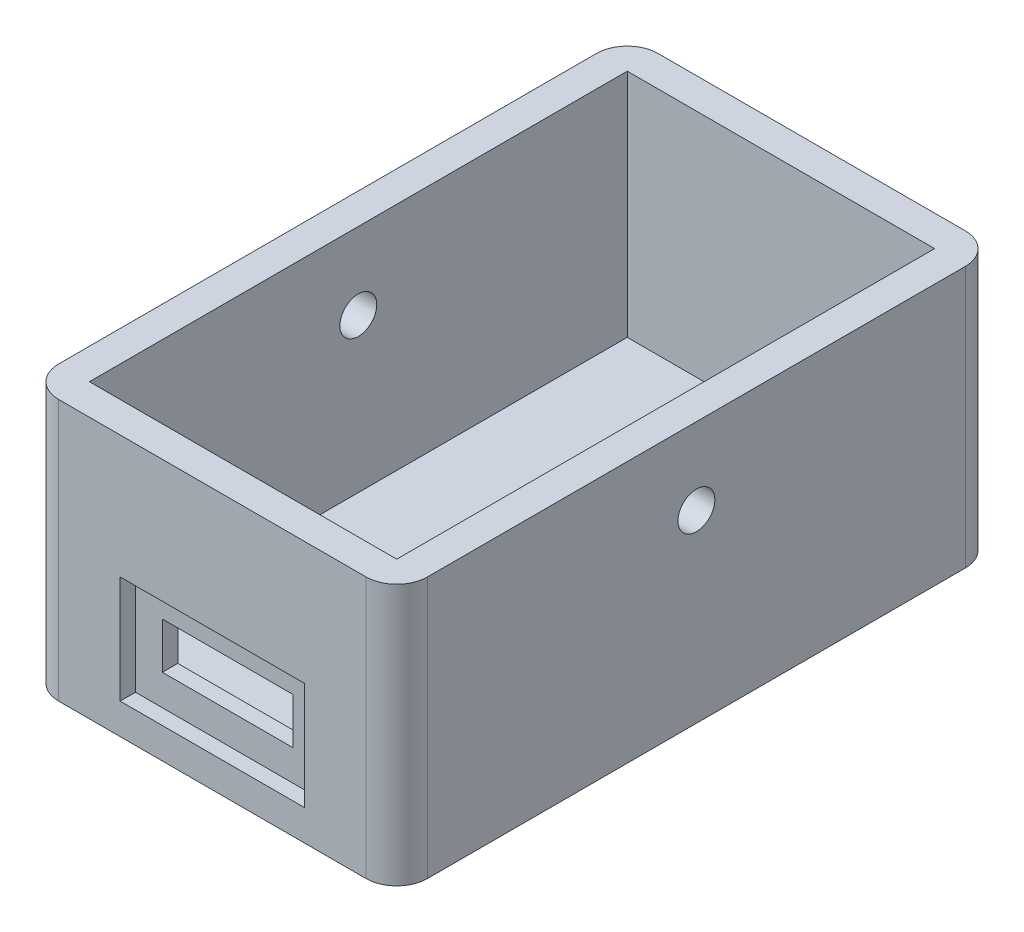
ISO-10303-21;
HEADER;
FILE_DESCRIPTION(('STEP AP214'),'2;1');
FILE_NAME('part.step','',(''),(''),'','','');
FILE_SCHEMA(('AUTOMOTIVE_DESIGN { 1 0 10303 214 1 1 1 1 }'));
ENDSEC;
DATA;
#1=APPLICATION_CONTEXT('core data for automotive mechanical design processes');
#2=APPLICATION_PROTOCOL_DEFINITION('international standard','automotive_design',2000,#1);
#3=PRODUCT_CONTEXT('',#1,'mechanical');
#4=PRODUCT('Part','Part','',(#3));
#5=PRODUCT_RELATED_PRODUCT_CATEGORY('part','',(#4));
#6=PRODUCT_DEFINITION_FORMATION('','',#4);
#7=PRODUCT_DEFINITION_CONTEXT('part definition',#1,'design');
#8=PRODUCT_DEFINITION('design','',#6,#7);
#9=PRODUCT_DEFINITION_SHAPE('','',#8);
#10=(LENGTH_UNIT() NAMED_UNIT(*) SI_UNIT(.MILLI.,.METRE.));
#11=(NAMED_UNIT(*) PLANE_ANGLE_UNIT() SI_UNIT($,.RADIAN.));
#12=(NAMED_UNIT(*) SI_UNIT($,.STERADIAN.) SOLID_ANGLE_UNIT());
#13=UNCERTAINTY_MEASURE_WITH_UNIT(LENGTH_MEASURE(1.E-05),#10,'distance_accuracy_value','');
#14=(GEOMETRIC_REPRESENTATION_CONTEXT(3) GLOBAL_UNCERTAINTY_ASSIGNED_CONTEXT((#13)) GLOBAL_UNIT_ASSIGNED_CONTEXT((#10,
#11,#12)) REPRESENTATION_CONTEXT('',''));
#15=CARTESIAN_POINT('',(0.,0.,0.));
#16=DIRECTION('',(0.,0.,1.));
#17=DIRECTION('',(1.,0.,0.));
#18=AXIS2_PLACEMENT_3D('',#15,#16,#17);
#19=CARTESIAN_POINT('',(-6.72058823529412,7.,7.88235294117647));
#20=DIRECTION('',(-1.,0.,0.));
#21=DIRECTION('',(0.,-1.,0.));
#22=AXIS2_PLACEMENT_3D('',#19,#20,#21);
#23=PLANE('',#22);
#24=DIRECTION('',(0.,1.,0.));
#25=VECTOR('',#24,1.);
#26=CARTESIAN_POINT('',(-6.72058823529412,7.,23.8823529411765));
#27=LINE('',#26,#25);
#28=CARTESIAN_POINT('',(-6.72058823529412,4.,23.8823529411765));
#29=VERTEX_POINT('',#28);
#30=CARTESIAN_POINT('',(-6.72058823529412,7.,23.8823529411765));
#31=VERTEX_POINT('',#30);
#32=EDGE_CURVE('E214',#29,#31,#27,.T.);
#33=ORIENTED_EDGE('',*,*,#32,.F.);
#34=DIRECTION('',(0.,0.,1.));
#35=VECTOR('',#34,1.);
#36=CARTESIAN_POINT('',(-6.72058823529412,4.,7.88235294117647));
#37=LINE('',#36,#35);
#38=CARTESIAN_POINT('',(-6.72058823529412,4.,22.8823529411765));
#39=VERTEX_POINT('',#38);
#40=EDGE_CURVE('E216',#39,#29,#37,.T.);
#41=ORIENTED_EDGE('',*,*,#40,.F.);
#42=DIRECTION('',(0.,1.,0.));
#43=VECTOR('',#42,1.);
#44=CARTESIAN_POINT('',(-6.72058823529412,17.,22.8823529411765));
#45=LINE('',#44,#43);
#46=CARTESIAN_POINT('',(-6.72058823529412,7.,22.8823529411765));
#47=VERTEX_POINT('',#46);
#48=EDGE_CURVE('E42',#39,#47,#45,.T.);
#49=ORIENTED_EDGE('',*,*,#48,.T.);
#50=DIRECTION('',(0.,0.,1.));
#51=VECTOR('',#50,1.);
#52=CARTESIAN_POINT('',(-6.72058823529412,7.,7.88235294117647));
#53=LINE('',#52,#51);
#54=EDGE_CURVE('E217',#47,#31,#53,.T.);
#55=ORIENTED_EDGE('',*,*,#54,.T.);
#56=EDGE_LOOP('',(#33,#41,#49,#55));
#57=FACE_BOUND('',#56,.T.);
#58=ADVANCED_FACE('F33',(#57),#23,.F.);
#59=CARTESIAN_POINT('',(-6.72058823529412,7.,7.88235294117647));
#60=DIRECTION('',(0.,1.,0.));
#61=DIRECTION('',(-1.,0.,0.));
#62=AXIS2_PLACEMENT_3D('',#59,#60,#61);
#63=PLANE('',#62);
#64=DIRECTION('',(1.,0.,0.));
#65=VECTOR('',#64,1.);
#66=CARTESIAN_POINT('',(-6.72058823529412,7.,23.8823529411765));
#67=LINE('',#66,#65);
#68=CARTESIAN_POINT('',(1.77941176470588,7.,23.8823529411765));
#69=VERTEX_POINT('',#68);
#70=EDGE_CURVE('E212',#31,#69,#67,.T.);
#71=ORIENTED_EDGE('',*,*,#70,.F.);
#72=ORIENTED_EDGE('',*,*,#54,.F.);
#73=DIRECTION('',(1.,0.,0.));
#74=VECTOR('',#73,1.);
#75=CARTESIAN_POINT('',(-14.4705882352941,7.,22.8823529411765));
#76=LINE('',#75,#74);
#77=CARTESIAN_POINT('',(1.77941176470588,7.,22.8823529411765));
#78=VERTEX_POINT('',#77);
#79=EDGE_CURVE('E321',#47,#78,#76,.T.);
#80=ORIENTED_EDGE('',*,*,#79,.T.);
#81=DIRECTION('',(0.,0.,1.));
#82=VECTOR('',#81,1.);
#83=CARTESIAN_POINT('',(1.77941176470588,7.,7.88235294117647));
#84=LINE('',#83,#82);
#85=EDGE_CURVE('E221',#78,#69,#84,.T.);
#86=ORIENTED_EDGE('',*,*,#85,.T.);
#87=EDGE_LOOP('',(#71,#72,#80,#86));
#88=FACE_BOUND('',#87,.T.);
#89=ADVANCED_FACE('F333',(#88),#63,.F.);
#90=CARTESIAN_POINT('',(1.77941176470588,7.,7.88235294117647));
#91=DIRECTION('',(1.,0.,0.));
#92=DIRECTION('',(0.,1.,0.));
#93=AXIS2_PLACEMENT_3D('',#90,#91,#92);
#94=PLANE('',#93);
#95=DIRECTION('',(0.,-1.,0.));
#96=VECTOR('',#95,1.);
#97=CARTESIAN_POINT('',(1.77941176470588,7.,23.8823529411765));
#98=LINE('',#97,#96);
#99=CARTESIAN_POINT('',(1.77941176470588,4.,23.8823529411765));
#100=VERTEX_POINT('',#99);
#101=EDGE_CURVE('E56',#69,#100,#98,.T.);
#102=ORIENTED_EDGE('',*,*,#101,.F.);
#103=ORIENTED_EDGE('',*,*,#85,.F.);
#104=DIRECTION('',(0.,-1.,0.));
#105=VECTOR('',#104,1.);
#106=CARTESIAN_POINT('',(1.77941176470588,17.,22.8823529411765));
#107=LINE('',#106,#105);
#108=CARTESIAN_POINT('',(1.77941176470588,4.,22.8823529411765));
#109=VERTEX_POINT('',#108);
#110=EDGE_CURVE('E318',#78,#109,#107,.T.);
#111=ORIENTED_EDGE('',*,*,#110,.T.);
#112=DIRECTION('',(0.,0.,1.));
#113=VECTOR('',#112,1.);
#114=CARTESIAN_POINT('',(1.77941176470588,4.,7.88235294117647));
#115=LINE('',#114,#113);
#116=EDGE_CURVE('E224',#109,#100,#115,.T.);
#117=ORIENTED_EDGE('',*,*,#116,.T.);
#118=EDGE_LOOP('',(#102,#103,#111,#117));
#119=FACE_BOUND('',#118,.T.);
#120=ADVANCED_FACE('F339',(#119),#94,.F.);
#121=CARTESIAN_POINT('',(-6.72058823529412,4.,7.88235294117647));
#122=DIRECTION('',(0.,-1.,0.));
#123=DIRECTION('',(0.,0.,-1.));
#124=AXIS2_PLACEMENT_3D('',#121,#122,#123);
#125=PLANE('',#124);
#126=DIRECTION('',(-1.,0.,0.));
#127=VECTOR('',#126,1.);
#128=CARTESIAN_POINT('',(-6.72058823529412,4.,23.8823529411765));
#129=LINE('',#128,#127);
#130=EDGE_CURVE('E11',#100,#29,#129,.T.);
#131=ORIENTED_EDGE('',*,*,#130,.F.);
#132=ORIENTED_EDGE('',*,*,#116,.F.);
#133=DIRECTION('',(-1.,0.,0.));
#134=VECTOR('',#133,1.);
#135=CARTESIAN_POINT('',(-14.4705882352941,4.,22.8823529411765));
#136=LINE('',#135,#134);
#137=EDGE_CURVE('E316',#109,#39,#136,.T.);
#138=ORIENTED_EDGE('',*,*,#137,.T.);
#139=ORIENTED_EDGE('',*,*,#40,.T.);
#140=EDGE_LOOP('',(#131,#132,#138,#139));
#141=FACE_BOUND('',#140,.T.);
#142=ADVANCED_FACE('F341',(#141),#125,.F.);
#143=CARTESIAN_POINT('',(-14.4705882352941,17.,-14.1176470588235));
#144=DIRECTION('',(1.,0.,0.));
#145=DIRECTION('',(0.,0.,-1.));
#146=AXIS2_PLACEMENT_3D('',#143,#144,#145);
#147=PLANE('',#146);
#148=CARTESIAN_POINT('',(-14.4705882352941,12.,5.38235294117647));
#149=DIRECTION('',(1.,0.,0.));
#150=DIRECTION('',(0.,0.,-1.));
#151=AXIS2_PLACEMENT_3D('',#148,#149,#150);
#152=CIRCLE('',#151,1.2);
#153=CARTESIAN_POINT('',(-14.4705882352941,12.,4.18235294117647));
#154=VERTEX_POINT('',#153);
#155=EDGE_CURVE('E196',#154,#154,#152,.T.);
#156=ORIENTED_EDGE('',*,*,#155,.T.);
#157=EDGE_LOOP('',(#156));
#158=FACE_BOUND('',#157,.T.);
#159=DIRECTION('',(0.,0.,1.));
#160=VECTOR('',#159,1.);
#161=CARTESIAN_POINT('',(-14.4705882352941,17.,-14.1176470588235));
#162=LINE('',#161,#160);
#163=CARTESIAN_POINT('',(-14.4705882352941,17.,-12.1176470588235));
#164=VERTEX_POINT('',#163);
#165=CARTESIAN_POINT('',(-14.4705882352941,17.,22.8823529411765));
#166=VERTEX_POINT('',#165);
#167=EDGE_CURVE('E257',#164,#166,#162,.T.);
#168=ORIENTED_EDGE('',*,*,#167,.F.);
#169=DIRECTION('',(0.,-1.,0.));
#170=VECTOR('',#169,1.);
#171=CARTESIAN_POINT('',(-14.4705882352941,17.,-12.1176470588235));
#172=LINE('',#171,#170);
#173=CARTESIAN_POINT('',(-14.4705882352941,0.,-12.1176470588235));
#174=VERTEX_POINT('',#173);
#175=EDGE_CURVE('E282',#164,#174,#172,.T.);
#176=ORIENTED_EDGE('',*,*,#175,.T.);
#177=DIRECTION('',(0.,0.,1.));
#178=VECTOR('',#177,1.);
#179=CARTESIAN_POINT('',(-14.4705882352941,0.,-14.1176470588235));
#180=LINE('',#179,#178);
#181=CARTESIAN_POINT('',(-14.4705882352941,0.,22.8823529411765));
#182=VERTEX_POINT('',#181);
#183=EDGE_CURVE('E245',#174,#182,#180,.T.);
#184=ORIENTED_EDGE('',*,*,#183,.T.);
#185=DIRECTION('',(0.,-1.,0.));
#186=VECTOR('',#185,1.);
#187=CARTESIAN_POINT('',(-14.4705882352941,17.,22.8823529411765));
#188=LINE('',#187,#186);
#189=EDGE_CURVE('E270',#182,#166,#188,.F.);
#190=ORIENTED_EDGE('',*,*,#189,.T.);
#191=EDGE_LOOP('',(#168,#176,#184,#190));
#192=FACE_BOUND('',#191,.T.);
#193=ADVANCED_FACE('F398',(#158,#192),#147,.F.);
#194=CARTESIAN_POINT('',(-14.4705882352941,17.,24.8823529411765));
#195=DIRECTION('',(0.,0.,-1.));
#196=DIRECTION('',(-1.,0.,0.));
#197=AXIS2_PLACEMENT_3D('',#194,#195,#196);
#198=PLANE('',#197);
#199=DIRECTION('',(1.,0.,0.));
#200=VECTOR('',#199,1.);
#201=CARTESIAN_POINT('',(-8.47058823529412,2.,24.8823529411765));
#202=LINE('',#201,#200);
#203=CARTESIAN_POINT('',(-8.47058823529412,2.,24.8823529411765));
#204=VERTEX_POINT('',#203);
#205=CARTESIAN_POINT('',(3.52941176470588,2.,24.8823529411765));
#206=VERTEX_POINT('',#205);
#207=EDGE_CURVE('E202',#204,#206,#202,.T.);
#208=ORIENTED_EDGE('',*,*,#207,.F.);
#209=DIRECTION('',(0.,-1.,0.));
#210=VECTOR('',#209,1.);
#211=CARTESIAN_POINT('',(-8.47058823529412,9.,24.8823529411765));
#212=LINE('',#211,#210);
#213=CARTESIAN_POINT('',(-8.47058823529412,9.,24.8823529411765));
#214=VERTEX_POINT('',#213);
#215=EDGE_CURVE('E49',#214,#204,#212,.T.);
#216=ORIENTED_EDGE('',*,*,#215,.F.);
#217=DIRECTION('',(-1.,0.,0.));
#218=VECTOR('',#217,1.);
#219=CARTESIAN_POINT('',(-8.47058823529412,9.,24.8823529411765));
#220=LINE('',#219,#218);
#221=CARTESIAN_POINT('',(3.52941176470588,9.,24.8823529411765));
#222=VERTEX_POINT('',#221);
#223=EDGE_CURVE('E190',#222,#214,#220,.T.);
#224=ORIENTED_EDGE('',*,*,#223,.F.);
#225=DIRECTION('',(0.,1.,0.));
#226=VECTOR('',#225,1.);
#227=CARTESIAN_POINT('',(3.52941176470588,9.,24.8823529411765));
#228=LINE('',#227,#226);
#229=EDGE_CURVE('E193',#206,#222,#228,.T.);
#230=ORIENTED_EDGE('',*,*,#229,.F.);
#231=EDGE_LOOP('',(#208,#216,#224,#230));
#232=FACE_BOUND('',#231,.T.);
#233=DIRECTION('',(1.,0.,0.));
#234=VECTOR('',#233,1.);
#235=CARTESIAN_POINT('',(-14.4705882352941,17.,24.8823529411765));
#236=LINE('',#235,#234);
#237=CARTESIAN_POINT('',(-12.4705882352941,17.,24.8823529411765));
#238=VERTEX_POINT('',#237);
#239=CARTESIAN_POINT('',(7.52941176470588,17.,24.8823529411765));
#240=VERTEX_POINT('',#239);
#241=EDGE_CURVE('E260',#238,#240,#236,.T.);
#242=ORIENTED_EDGE('',*,*,#241,.F.);
#243=DIRECTION('',(0.,-1.,0.));
#244=VECTOR('',#243,1.);
#245=CARTESIAN_POINT('',(-12.4705882352941,17.,24.8823529411765));
#246=LINE('',#245,#244);
#247=CARTESIAN_POINT('',(-12.4705882352941,0.,24.8823529411765));
#248=VERTEX_POINT('',#247);
#249=EDGE_CURVE('E308',#238,#248,#246,.T.);
#250=ORIENTED_EDGE('',*,*,#249,.T.);
#251=DIRECTION('',(1.,0.,0.));
#252=VECTOR('',#251,1.);
#253=CARTESIAN_POINT('',(-14.4705882352941,0.,24.8823529411765));
#254=LINE('',#253,#252);
#255=CARTESIAN_POINT('',(7.52941176470588,0.,24.8823529411765));
#256=VERTEX_POINT('',#255);
#257=EDGE_CURVE('E273',#248,#256,#254,.T.);
#258=ORIENTED_EDGE('',*,*,#257,.T.);
#259=DIRECTION('',(0.,-1.,0.));
#260=VECTOR('',#259,1.);
#261=CARTESIAN_POINT('',(7.52941176470588,17.,24.8823529411765));
#262=LINE('',#261,#260);
#263=EDGE_CURVE('E306',#256,#240,#262,.F.);
#264=ORIENTED_EDGE('',*,*,#263,.T.);
#265=EDGE_LOOP('',(#242,#250,#258,#264));
#266=FACE_BOUND('',#265,.T.);
#267=ADVANCED_FACE('F394',(#232,#266),#198,.F.);
#268=CARTESIAN_POINT('',(9.52941176470588,17.,-14.1176470588235));
#269=DIRECTION('',(-1.,0.,0.));
#270=DIRECTION('',(0.,0.,1.));
#271=AXIS2_PLACEMENT_3D('',#268,#269,#270);
#272=PLANE('',#271);
#273=CARTESIAN_POINT('',(9.52941176470588,12.,5.38235294117647));
#274=DIRECTION('',(1.,0.,0.));
#275=DIRECTION('',(0.,0.,-1.));
#276=AXIS2_PLACEMENT_3D('',#273,#274,#275);
#277=CIRCLE('',#276,1.2);
#278=CARTESIAN_POINT('',(9.52941176470588,12.,4.18235294117647));
#279=VERTEX_POINT('',#278);
#280=EDGE_CURVE('E554',#279,#279,#277,.T.);
#281=ORIENTED_EDGE('',*,*,#280,.F.);
#282=EDGE_LOOP('',(#281));
#283=FACE_BOUND('',#282,.T.);
#284=DIRECTION('',(0.,0.,-1.));
#285=VECTOR('',#284,1.);
#286=CARTESIAN_POINT('',(9.52941176470588,17.,-14.1176470588235));
#287=LINE('',#286,#285);
#288=CARTESIAN_POINT('',(9.52941176470588,17.,22.8823529411765));
#289=VERTEX_POINT('',#288);
#290=CARTESIAN_POINT('',(9.52941176470588,17.,-12.1176470588235));
#291=VERTEX_POINT('',#290);
#292=EDGE_CURVE('E264',#289,#291,#287,.T.);
#293=ORIENTED_EDGE('',*,*,#292,.F.);
#294=DIRECTION('',(0.,-1.,0.));
#295=VECTOR('',#294,1.);
#296=CARTESIAN_POINT('',(9.52941176470588,17.,22.8823529411765));
#297=LINE('',#296,#295);
#298=CARTESIAN_POINT('',(9.52941176470588,0.,22.8823529411765));
#299=VERTEX_POINT('',#298);
#300=EDGE_CURVE('E313',#289,#299,#297,.T.);
#301=ORIENTED_EDGE('',*,*,#300,.T.);
#302=DIRECTION('',(0.,0.,-1.));
#303=VECTOR('',#302,1.);
#304=CARTESIAN_POINT('',(9.52941176470588,0.,-14.1176470588235));
#305=LINE('',#304,#303);
#306=CARTESIAN_POINT('',(9.52941176470588,0.,-12.1176470588235));
#307=VERTEX_POINT('',#306);
#308=EDGE_CURVE('E276',#299,#307,#305,.T.);
#309=ORIENTED_EDGE('',*,*,#308,.T.);
#310=DIRECTION('',(0.,-1.,0.));
#311=VECTOR('',#310,1.);
#312=CARTESIAN_POINT('',(9.52941176470588,17.,-12.1176470588235));
#313=LINE('',#312,#311);
#314=EDGE_CURVE('E311',#307,#291,#313,.F.);
#315=ORIENTED_EDGE('',*,*,#314,.T.);
#316=EDGE_LOOP('',(#293,#301,#309,#315));
#317=FACE_BOUND('',#316,.T.);
#318=ADVANCED_FACE('F390',(#283,#317),#272,.F.);
#319=CARTESIAN_POINT('',(-14.4705882352941,17.,-14.1176470588235));
#320=DIRECTION('',(0.,0.,1.));
#321=DIRECTION('',(1.,0.,0.));
#322=AXIS2_PLACEMENT_3D('',#319,#320,#321);
#323=PLANE('',#322);
#324=DIRECTION('',(-1.,0.,0.));
#325=VECTOR('',#324,1.);
#326=CARTESIAN_POINT('',(-14.4705882352941,0.,-14.1176470588235));
#327=LINE('',#326,#325);
#328=CARTESIAN_POINT('',(7.52941176470588,0.,-14.1176470588235));
#329=VERTEX_POINT('',#328);
#330=CARTESIAN_POINT('',(-12.4705882352941,0.,-14.1176470588235));
#331=VERTEX_POINT('',#330);
#332=EDGE_CURVE('E261',#329,#331,#327,.T.);
#333=ORIENTED_EDGE('',*,*,#332,.T.);
#334=DIRECTION('',(0.,-1.,0.));
#335=VECTOR('',#334,1.);
#336=CARTESIAN_POINT('',(-12.4705882352941,17.,-14.1176470588235));
#337=LINE('',#336,#335);
#338=CARTESIAN_POINT('',(-12.4705882352941,17.,-14.1176470588235));
#339=VERTEX_POINT('',#338);
#340=EDGE_CURVE('E296',#331,#339,#337,.F.);
#341=ORIENTED_EDGE('',*,*,#340,.T.);
#342=DIRECTION('',(-1.,0.,0.));
#343=VECTOR('',#342,1.);
#344=CARTESIAN_POINT('',(-14.4705882352941,17.,-14.1176470588235));
#345=LINE('',#344,#343);
#346=CARTESIAN_POINT('',(7.52941176470588,17.,-14.1176470588235));
#347=VERTEX_POINT('',#346);
#348=EDGE_CURVE('E267',#347,#339,#345,.T.);
#349=ORIENTED_EDGE('',*,*,#348,.F.);
#350=DIRECTION('',(0.,-1.,0.));
#351=VECTOR('',#350,1.);
#352=CARTESIAN_POINT('',(7.52941176470588,17.,-14.1176470588235));
#353=LINE('',#352,#351);
#354=EDGE_CURVE('E293',#347,#329,#353,.T.);
#355=ORIENTED_EDGE('',*,*,#354,.T.);
#356=EDGE_LOOP('',(#333,#341,#349,#355));
#357=FACE_BOUND('',#356,.T.);
#358=ADVANCED_FACE('F382',(#357),#323,.F.);
#359=CARTESIAN_POINT('',(0.,17.,0.));
#360=DIRECTION('',(0.,1.,0.));
#361=DIRECTION('',(0.,0.,1.));
#362=AXIS2_PLACEMENT_3D('',#359,#360,#361);
#363=PLANE('',#362);
#364=DIRECTION('',(-1.,0.,0.));
#365=VECTOR('',#364,1.);
#366=CARTESIAN_POINT('',(-14.4705882352941,17.,-12.1176470588235));
#367=LINE('',#366,#365);
#368=CARTESIAN_POINT('',(7.52941176470588,17.,-12.1176470588235));
#369=VERTEX_POINT('',#368);
#370=CARTESIAN_POINT('',(-12.4705882352941,17.,-12.1176470588235));
#371=VERTEX_POINT('',#370);
#372=EDGE_CURVE('E236',#369,#371,#367,.T.);
#373=ORIENTED_EDGE('',*,*,#372,.F.);
#374=DIRECTION('',(0.,0.,-1.));
#375=VECTOR('',#374,1.);
#376=CARTESIAN_POINT('',(7.52941176470588,17.,-14.1176470588235));
#377=LINE('',#376,#375);
#378=CARTESIAN_POINT('',(7.52941176470588,17.,22.8823529411765));
#379=VERTEX_POINT('',#378);
#380=EDGE_CURVE('E252',#379,#369,#377,.T.);
#381=ORIENTED_EDGE('',*,*,#380,.F.);
#382=DIRECTION('',(1.,0.,0.));
#383=VECTOR('',#382,1.);
#384=CARTESIAN_POINT('',(-14.4705882352941,17.,22.8823529411765));
#385=LINE('',#384,#383);
#386=CARTESIAN_POINT('',(-12.4705882352941,17.,22.8823529411765));
#387=VERTEX_POINT('',#386);
#388=EDGE_CURVE('E250',#387,#379,#385,.T.);
#389=ORIENTED_EDGE('',*,*,#388,.F.);
#390=DIRECTION('',(0.,0.,1.));
#391=VECTOR('',#390,1.);
#392=CARTESIAN_POINT('',(-12.4705882352941,17.,-14.1176470588235));
#393=LINE('',#392,#391);
#394=EDGE_CURVE('E247',#371,#387,#393,.T.);
#395=ORIENTED_EDGE('',*,*,#394,.F.);
#396=EDGE_LOOP('',(#373,#381,#389,#395));
#397=FACE_BOUND('',#396,.T.);
#398=ORIENTED_EDGE('',*,*,#348,.T.);
#399=CARTESIAN_POINT('',(-12.4705882352941,17.,-12.1176470588235));
#400=DIRECTION('',(0.,1.,0.));
#401=DIRECTION('',(0.,0.,1.));
#402=AXIS2_PLACEMENT_3D('',#399,#400,#401);
#403=CIRCLE('',#402,2.);
#404=EDGE_CURVE('E304',#339,#164,#403,.T.);
#405=ORIENTED_EDGE('',*,*,#404,.T.);
#406=ORIENTED_EDGE('',*,*,#167,.T.);
#407=CARTESIAN_POINT('',(-12.4705882352941,17.,22.8823529411765));
#408=DIRECTION('',(0.,1.,0.));
#409=DIRECTION('',(0.,0.,1.));
#410=AXIS2_PLACEMENT_3D('',#407,#408,#409);
#411=CIRCLE('',#410,2.);
#412=EDGE_CURVE('E302',#166,#238,#411,.T.);
#413=ORIENTED_EDGE('',*,*,#412,.T.);
#414=ORIENTED_EDGE('',*,*,#241,.T.);
#415=CARTESIAN_POINT('',(7.52941176470588,17.,22.8823529411765));
#416=DIRECTION('',(0.,1.,0.));
#417=DIRECTION('',(0.,0.,1.));
#418=AXIS2_PLACEMENT_3D('',#415,#416,#417);
#419=CIRCLE('',#418,2.);
#420=EDGE_CURVE('E300',#240,#289,#419,.T.);
#421=ORIENTED_EDGE('',*,*,#420,.T.);
#422=ORIENTED_EDGE('',*,*,#292,.T.);
#423=CARTESIAN_POINT('',(7.52941176470588,17.,-12.1176470588235));
#424=DIRECTION('',(0.,1.,0.));
#425=DIRECTION('',(0.,0.,1.));
#426=AXIS2_PLACEMENT_3D('',#423,#424,#425);
#427=CIRCLE('',#426,2.);
#428=EDGE_CURVE('E298',#291,#347,#427,.T.);
#429=ORIENTED_EDGE('',*,*,#428,.T.);
#430=EDGE_LOOP('',(#398,#405,#406,#413,#414,#421,#422,#429));
#431=FACE_BOUND('',#430,.T.);
#432=ADVANCED_FACE('F378',(#397,#431),#363,.T.);
#433=CARTESIAN_POINT('',(0.,0.,0.));
#434=DIRECTION('',(0.,1.,0.));
#435=DIRECTION('',(0.,0.,1.));
#436=AXIS2_PLACEMENT_3D('',#433,#434,#435);
#437=PLANE('',#436);
#438=ORIENTED_EDGE('',*,*,#183,.F.);
#439=CARTESIAN_POINT('',(-12.4705882352941,0.,-12.1176470588235));
#440=DIRECTION('',(0.,1.,0.));
#441=DIRECTION('',(0.,0.,1.));
#442=AXIS2_PLACEMENT_3D('',#439,#440,#441);
#443=CIRCLE('',#442,2.);
#444=EDGE_CURVE('E291',#174,#331,#443,.F.);
#445=ORIENTED_EDGE('',*,*,#444,.T.);
#446=ORIENTED_EDGE('',*,*,#332,.F.);
#447=CARTESIAN_POINT('',(7.52941176470588,0.,-12.1176470588235));
#448=DIRECTION('',(0.,1.,0.));
#449=DIRECTION('',(0.,0.,1.));
#450=AXIS2_PLACEMENT_3D('',#447,#448,#449);
#451=CIRCLE('',#450,2.);
#452=EDGE_CURVE('E285',#329,#307,#451,.F.);
#453=ORIENTED_EDGE('',*,*,#452,.T.);
#454=ORIENTED_EDGE('',*,*,#308,.F.);
#455=CARTESIAN_POINT('',(7.52941176470588,0.,22.8823529411765));
#456=DIRECTION('',(0.,1.,0.));
#457=DIRECTION('',(0.,0.,1.));
#458=AXIS2_PLACEMENT_3D('',#455,#456,#457);
#459=CIRCLE('',#458,2.);
#460=EDGE_CURVE('E287',#299,#256,#459,.F.);
#461=ORIENTED_EDGE('',*,*,#460,.T.);
#462=ORIENTED_EDGE('',*,*,#257,.F.);
#463=CARTESIAN_POINT('',(-12.4705882352941,0.,22.8823529411765));
#464=DIRECTION('',(0.,1.,0.));
#465=DIRECTION('',(0.,0.,1.));
#466=AXIS2_PLACEMENT_3D('',#463,#464,#465);
#467=CIRCLE('',#466,2.);
#468=EDGE_CURVE('E289',#248,#182,#467,.F.);
#469=ORIENTED_EDGE('',*,*,#468,.T.);
#470=EDGE_LOOP('',(#438,#445,#446,#453,#454,#461,#462,#469));
#471=FACE_BOUND('',#470,.T.);
#472=ADVANCED_FACE('F381',(#471),#437,.F.);
#473=CARTESIAN_POINT('',(-12.4705882352941,17.,-12.1176470588235));
#474=DIRECTION('',(0.,-1.,0.));
#475=DIRECTION('',(0.,0.,-1.));
#476=AXIS2_PLACEMENT_3D('',#473,#474,#475);
#477=CYLINDRICAL_SURFACE('',#476,2.);
#478=ORIENTED_EDGE('',*,*,#404,.F.);
#479=ORIENTED_EDGE('',*,*,#340,.F.);
#480=ORIENTED_EDGE('',*,*,#444,.F.);
#481=ORIENTED_EDGE('',*,*,#175,.F.);
#482=EDGE_LOOP('',(#478,#479,#480,#481));
#483=FACE_BOUND('',#482,.T.);
#484=ADVANCED_FACE('F386',(#483),#477,.T.);
#485=CARTESIAN_POINT('',(-12.4705882352941,17.,22.8823529411765));
#486=DIRECTION('',(0.,-1.,0.));
#487=DIRECTION('',(0.,0.,-1.));
#488=AXIS2_PLACEMENT_3D('',#485,#486,#487);
#489=CYLINDRICAL_SURFACE('',#488,2.);
#490=ORIENTED_EDGE('',*,*,#412,.F.);
#491=ORIENTED_EDGE('',*,*,#189,.F.);
#492=ORIENTED_EDGE('',*,*,#468,.F.);
#493=ORIENTED_EDGE('',*,*,#249,.F.);
#494=EDGE_LOOP('',(#490,#491,#492,#493));
#495=FACE_BOUND('',#494,.T.);
#496=ADVANCED_FACE('F405',(#495),#489,.T.);
#497=CARTESIAN_POINT('',(7.52941176470588,17.,22.8823529411765));
#498=DIRECTION('',(0.,-1.,0.));
#499=DIRECTION('',(0.,0.,-1.));
#500=AXIS2_PLACEMENT_3D('',#497,#498,#499);
#501=CYLINDRICAL_SURFACE('',#500,2.);
#502=ORIENTED_EDGE('',*,*,#420,.F.);
#503=ORIENTED_EDGE('',*,*,#263,.F.);
#504=ORIENTED_EDGE('',*,*,#460,.F.);
#505=ORIENTED_EDGE('',*,*,#300,.F.);
#506=EDGE_LOOP('',(#502,#503,#504,#505));
#507=FACE_BOUND('',#506,.T.);
#508=ADVANCED_FACE('F408',(#507),#501,.T.);
#509=CARTESIAN_POINT('',(7.52941176470588,17.,-12.1176470588235));
#510=DIRECTION('',(0.,-1.,0.));
#511=DIRECTION('',(0.,0.,-1.));
#512=AXIS2_PLACEMENT_3D('',#509,#510,#511);
#513=CYLINDRICAL_SURFACE('',#512,2.);
#514=ORIENTED_EDGE('',*,*,#428,.F.);
#515=ORIENTED_EDGE('',*,*,#314,.F.);
#516=ORIENTED_EDGE('',*,*,#452,.F.);
#517=ORIENTED_EDGE('',*,*,#354,.F.);
#518=EDGE_LOOP('',(#514,#515,#516,#517));
#519=FACE_BOUND('',#518,.T.);
#520=ADVANCED_FACE('F35',(#519),#513,.T.);
#521=CARTESIAN_POINT('',(-12.4705882352941,17.,-14.1176470588235));
#522=DIRECTION('',(1.,0.,0.));
#523=DIRECTION('',(0.,0.,-1.));
#524=AXIS2_PLACEMENT_3D('',#521,#522,#523);
#525=PLANE('',#524);
#526=CARTESIAN_POINT('',(-12.4705882352941,12.,5.38235294117647));
#527=DIRECTION('',(1.,0.,0.));
#528=DIRECTION('',(0.,0.,-1.));
#529=AXIS2_PLACEMENT_3D('',#526,#527,#528);
#530=CIRCLE('',#529,1.2);
#531=CARTESIAN_POINT('',(-12.4705882352941,12.,4.18235294117647));
#532=VERTEX_POINT('',#531);
#533=EDGE_CURVE('E550',#532,#532,#530,.T.);
#534=ORIENTED_EDGE('',*,*,#533,.F.);
#535=EDGE_LOOP('',(#534));
#536=FACE_BOUND('',#535,.T.);
#537=ORIENTED_EDGE('',*,*,#394,.T.);
#538=DIRECTION('',(0.,1.,0.));
#539=VECTOR('',#538,1.);
#540=CARTESIAN_POINT('',(-12.4705882352941,17.,22.8823529411765));
#541=LINE('',#540,#539);
#542=CARTESIAN_POINT('',(-12.4705882352941,2.,22.8823529411765));
#543=VERTEX_POINT('',#542);
#544=EDGE_CURVE('E232',#543,#387,#541,.T.);
#545=ORIENTED_EDGE('',*,*,#544,.F.);
#546=DIRECTION('',(0.,0.,1.));
#547=VECTOR('',#546,1.);
#548=CARTESIAN_POINT('',(-12.4705882352941,2.,-14.1176470588235));
#549=LINE('',#548,#547);
#550=CARTESIAN_POINT('',(-12.4705882352941,2.,-12.1176470588235));
#551=VERTEX_POINT('',#550);
#552=EDGE_CURVE('E220',#551,#543,#549,.T.);
#553=ORIENTED_EDGE('',*,*,#552,.F.);
#554=DIRECTION('',(0.,1.,0.));
#555=VECTOR('',#554,1.);
#556=CARTESIAN_POINT('',(-12.4705882352941,17.,-12.1176470588235));
#557=LINE('',#556,#555);
#558=EDGE_CURVE('E229',#551,#371,#557,.T.);
#559=ORIENTED_EDGE('',*,*,#558,.T.);
#560=EDGE_LOOP('',(#537,#545,#553,#559));
#561=FACE_BOUND('',#560,.T.);
#562=ADVANCED_FACE('F365',(#536,#561),#525,.T.);
#563=CARTESIAN_POINT('',(-14.4705882352941,17.,22.8823529411765));
#564=DIRECTION('',(0.,0.,-1.));
#565=DIRECTION('',(-1.,0.,0.));
#566=AXIS2_PLACEMENT_3D('',#563,#564,#565);
#567=PLANE('',#566);
#568=ORIENTED_EDGE('',*,*,#48,.F.);
#569=ORIENTED_EDGE('',*,*,#137,.F.);
#570=ORIENTED_EDGE('',*,*,#110,.F.);
#571=ORIENTED_EDGE('',*,*,#79,.F.);
#572=EDGE_LOOP('',(#568,#569,#570,#571));
#573=FACE_BOUND('',#572,.T.);
#574=ORIENTED_EDGE('',*,*,#388,.T.);
#575=DIRECTION('',(0.,1.,0.));
#576=VECTOR('',#575,1.);
#577=CARTESIAN_POINT('',(7.52941176470588,17.,22.8823529411765));
#578=LINE('',#577,#576);
#579=CARTESIAN_POINT('',(7.52941176470588,2.,22.8823529411765));
#580=VERTEX_POINT('',#579);
#581=EDGE_CURVE('E231',#580,#379,#578,.T.);
#582=ORIENTED_EDGE('',*,*,#581,.F.);
#583=DIRECTION('',(1.,0.,0.));
#584=VECTOR('',#583,1.);
#585=CARTESIAN_POINT('',(-14.4705882352941,2.,22.8823529411765));
#586=LINE('',#585,#584);
#587=EDGE_CURVE('E234',#543,#580,#586,.T.);
#588=ORIENTED_EDGE('',*,*,#587,.F.);
#589=ORIENTED_EDGE('',*,*,#544,.T.);
#590=EDGE_LOOP('',(#574,#582,#588,#589));
#591=FACE_BOUND('',#590,.T.);
#592=ADVANCED_FACE('F336',(#573,#591),#567,.T.);
#593=CARTESIAN_POINT('',(7.52941176470588,17.,-14.1176470588235));
#594=DIRECTION('',(-1.,0.,0.));
#595=DIRECTION('',(0.,0.,1.));
#596=AXIS2_PLACEMENT_3D('',#593,#594,#595);
#597=PLANE('',#596);
#598=CARTESIAN_POINT('',(7.52941176470588,12.,5.38235294117647));
#599=DIRECTION('',(-1.,0.,0.));
#600=DIRECTION('',(0.,0.,1.));
#601=AXIS2_PLACEMENT_3D('',#598,#599,#600);
#602=CIRCLE('',#601,1.2);
#603=CARTESIAN_POINT('',(7.52941176470588,12.,6.58235294117647));
#604=VERTEX_POINT('',#603);
#605=EDGE_CURVE('E37',#604,#604,#602,.T.);
#606=ORIENTED_EDGE('',*,*,#605,.F.);
#607=EDGE_LOOP('',(#606));
#608=FACE_BOUND('',#607,.T.);
#609=ORIENTED_EDGE('',*,*,#380,.T.);
#610=DIRECTION('',(0.,1.,0.));
#611=VECTOR('',#610,1.);
#612=CARTESIAN_POINT('',(7.52941176470588,17.,-12.1176470588235));
#613=LINE('',#612,#611);
#614=CARTESIAN_POINT('',(7.52941176470588,2.,-12.1176470588235));
#615=VERTEX_POINT('',#614);
#616=EDGE_CURVE('E241',#615,#369,#613,.T.);
#617=ORIENTED_EDGE('',*,*,#616,.F.);
#618=DIRECTION('',(0.,0.,-1.));
#619=VECTOR('',#618,1.);
#620=CARTESIAN_POINT('',(7.52941176470588,2.,-14.1176470588235));
#621=LINE('',#620,#619);
#622=EDGE_CURVE('E238',#580,#615,#621,.T.);
#623=ORIENTED_EDGE('',*,*,#622,.F.);
#624=ORIENTED_EDGE('',*,*,#581,.T.);
#625=EDGE_LOOP('',(#609,#617,#623,#624));
#626=FACE_BOUND('',#625,.T.);
#627=ADVANCED_FACE('F371',(#608,#626),#597,.T.);
#628=CARTESIAN_POINT('',(-14.4705882352941,17.,-12.1176470588235));
#629=DIRECTION('',(0.,0.,1.));
#630=DIRECTION('',(1.,0.,0.));
#631=AXIS2_PLACEMENT_3D('',#628,#629,#630);
#632=PLANE('',#631);
#633=DIRECTION('',(-1.,0.,0.));
#634=VECTOR('',#633,1.);
#635=CARTESIAN_POINT('',(-14.4705882352941,2.,-12.1176470588235));
#636=LINE('',#635,#634);
#637=EDGE_CURVE('E243',#615,#551,#636,.T.);
#638=ORIENTED_EDGE('',*,*,#637,.F.);
#639=ORIENTED_EDGE('',*,*,#616,.T.);
#640=ORIENTED_EDGE('',*,*,#372,.T.);
#641=ORIENTED_EDGE('',*,*,#558,.F.);
#642=EDGE_LOOP('',(#638,#639,#640,#641));
#643=FACE_BOUND('',#642,.T.);
#644=ADVANCED_FACE('F351',(#643),#632,.T.);
#645=CARTESIAN_POINT('',(0.,2.,0.));
#646=DIRECTION('',(0.,1.,0.));
#647=DIRECTION('',(0.,0.,1.));
#648=AXIS2_PLACEMENT_3D('',#645,#646,#647);
#649=PLANE('',#648);
#650=ORIENTED_EDGE('',*,*,#552,.T.);
#651=ORIENTED_EDGE('',*,*,#587,.T.);
#652=ORIENTED_EDGE('',*,*,#622,.T.);
#653=ORIENTED_EDGE('',*,*,#637,.T.);
#654=EDGE_LOOP('',(#650,#651,#652,#653));
#655=FACE_BOUND('',#654,.T.);
#656=ADVANCED_FACE('F343',(#655),#649,.T.);
#657=CARTESIAN_POINT('',(0.,0.,23.8823529411765));
#658=DIRECTION('',(0.,0.,1.));
#659=DIRECTION('',(1.,0.,0.));
#660=AXIS2_PLACEMENT_3D('',#657,#658,#659);
#661=PLANE('',#660);
#662=DIRECTION('',(0.,-1.,0.));
#663=VECTOR('',#662,1.);
#664=CARTESIAN_POINT('',(-8.47058823529412,9.,23.8823529411765));
#665=LINE('',#664,#663);
#666=CARTESIAN_POINT('',(-8.47058823529412,9.,23.8823529411765));
#667=VERTEX_POINT('',#666);
#668=CARTESIAN_POINT('',(-8.47058823529412,2.,23.8823529411765));
#669=VERTEX_POINT('',#668);
#670=EDGE_CURVE('E172',#667,#669,#665,.T.);
#671=ORIENTED_EDGE('',*,*,#670,.T.);
#672=DIRECTION('',(1.,0.,0.));
#673=VECTOR('',#672,1.);
#674=CARTESIAN_POINT('',(-8.47058823529412,2.,23.8823529411765));
#675=LINE('',#674,#673);
#676=CARTESIAN_POINT('',(3.52941176470588,2.,23.8823529411765));
#677=VERTEX_POINT('',#676);
#678=EDGE_CURVE('E181',#669,#677,#675,.T.);
#679=ORIENTED_EDGE('',*,*,#678,.T.);
#680=DIRECTION('',(0.,1.,0.));
#681=VECTOR('',#680,1.);
#682=CARTESIAN_POINT('',(3.52941176470588,9.,23.8823529411765));
#683=LINE('',#682,#681);
#684=CARTESIAN_POINT('',(3.52941176470588,9.,23.8823529411765));
#685=VERTEX_POINT('',#684);
#686=EDGE_CURVE('E186',#677,#685,#683,.T.);
#687=ORIENTED_EDGE('',*,*,#686,.T.);
#688=DIRECTION('',(-1.,0.,0.));
#689=VECTOR('',#688,1.);
#690=CARTESIAN_POINT('',(-8.47058823529412,9.,23.8823529411765));
#691=LINE('',#690,#689);
#692=EDGE_CURVE('E178',#685,#667,#691,.T.);
#693=ORIENTED_EDGE('',*,*,#692,.T.);
#694=EDGE_LOOP('',(#671,#679,#687,#693));
#695=FACE_BOUND('',#694,.T.);
#696=ORIENTED_EDGE('',*,*,#32,.T.);
#697=ORIENTED_EDGE('',*,*,#70,.T.);
#698=ORIENTED_EDGE('',*,*,#101,.T.);
#699=ORIENTED_EDGE('',*,*,#130,.T.);
#700=EDGE_LOOP('',(#696,#697,#698,#699));
#701=FACE_BOUND('',#700,.T.);
#702=ADVANCED_FACE('F188',(#695,#701),#661,.T.);
#703=CARTESIAN_POINT('',(-8.47058823529412,9.,23.8823529411765));
#704=DIRECTION('',(-1.,0.,0.));
#705=DIRECTION('',(0.,0.,1.));
#706=AXIS2_PLACEMENT_3D('',#703,#704,#705);
#707=PLANE('',#706);
#708=ORIENTED_EDGE('',*,*,#215,.T.);
#709=DIRECTION('',(0.,0.,1.));
#710=VECTOR('',#709,1.);
#711=CARTESIAN_POINT('',(-8.47058823529412,2.,23.8823529411765));
#712=LINE('',#711,#710);
#713=EDGE_CURVE('E168',#669,#204,#712,.T.);
#714=ORIENTED_EDGE('',*,*,#713,.F.);
#715=ORIENTED_EDGE('',*,*,#670,.F.);
#716=DIRECTION('',(0.,0.,1.));
#717=VECTOR('',#716,1.);
#718=CARTESIAN_POINT('',(-8.47058823529412,9.,23.8823529411765));
#719=LINE('',#718,#717);
#720=EDGE_CURVE('E206',#667,#214,#719,.T.);
#721=ORIENTED_EDGE('',*,*,#720,.T.);
#722=EDGE_LOOP('',(#708,#714,#715,#721));
#723=FACE_BOUND('',#722,.T.);
#724=ADVANCED_FACE('F170',(#723),#707,.F.);
#725=CARTESIAN_POINT('',(-8.47058823529412,9.,23.8823529411765));
#726=DIRECTION('',(0.,1.,0.));
#727=DIRECTION('',(-1.,0.,0.));
#728=AXIS2_PLACEMENT_3D('',#725,#726,#727);
#729=PLANE('',#728);
#730=ORIENTED_EDGE('',*,*,#223,.T.);
#731=ORIENTED_EDGE('',*,*,#720,.F.);
#732=ORIENTED_EDGE('',*,*,#692,.F.);
#733=DIRECTION('',(0.,0.,1.));
#734=VECTOR('',#733,1.);
#735=CARTESIAN_POINT('',(3.52941176470588,9.,23.8823529411765));
#736=LINE('',#735,#734);
#737=EDGE_CURVE('E208',#685,#222,#736,.T.);
#738=ORIENTED_EDGE('',*,*,#737,.T.);
#739=EDGE_LOOP('',(#730,#731,#732,#738));
#740=FACE_BOUND('',#739,.T.);
#741=ADVANCED_FACE('F349',(#740),#729,.F.);
#742=CARTESIAN_POINT('',(3.52941176470588,9.,23.8823529411765));
#743=DIRECTION('',(1.,0.,0.));
#744=DIRECTION('',(0.,1.,0.));
#745=AXIS2_PLACEMENT_3D('',#742,#743,#744);
#746=PLANE('',#745);
#747=ORIENTED_EDGE('',*,*,#229,.T.);
#748=ORIENTED_EDGE('',*,*,#737,.F.);
#749=ORIENTED_EDGE('',*,*,#686,.F.);
#750=DIRECTION('',(0.,0.,1.));
#751=VECTOR('',#750,1.);
#752=CARTESIAN_POINT('',(3.52941176470588,2.,23.8823529411765));
#753=LINE('',#752,#751);
#754=EDGE_CURVE('E177',#677,#206,#753,.T.);
#755=ORIENTED_EDGE('',*,*,#754,.T.);
#756=EDGE_LOOP('',(#747,#748,#749,#755));
#757=FACE_BOUND('',#756,.T.);
#758=ADVANCED_FACE('F508',(#757),#746,.F.);
#759=CARTESIAN_POINT('',(-8.47058823529412,2.,23.8823529411765));
#760=DIRECTION('',(0.,-1.,0.));
#761=DIRECTION('',(0.,0.,-1.));
#762=AXIS2_PLACEMENT_3D('',#759,#760,#761);
#763=PLANE('',#762);
#764=ORIENTED_EDGE('',*,*,#207,.T.);
#765=ORIENTED_EDGE('',*,*,#754,.F.);
#766=ORIENTED_EDGE('',*,*,#678,.F.);
#767=ORIENTED_EDGE('',*,*,#713,.T.);
#768=EDGE_LOOP('',(#764,#765,#766,#767));
#769=FACE_BOUND('',#768,.T.);
#770=ADVANCED_FACE('F182',(#769),#763,.F.);
#771=CARTESIAN_POINT('',(-20.4705882352941,12.,5.38235294117648));
#772=DIRECTION('',(1.,0.,0.));
#773=DIRECTION('',(0.,0.,-1.));
#774=AXIS2_PLACEMENT_3D('',#771,#772,#773);
#775=CYLINDRICAL_SURFACE('',#774,1.2);
#776=ORIENTED_EDGE('',*,*,#605,.T.);
#777=EDGE_LOOP('',(#776));
#778=FACE_BOUND('',#777,.T.);
#779=ORIENTED_EDGE('',*,*,#280,.T.);
#780=EDGE_LOOP('',(#779));
#781=FACE_BOUND('',#780,.T.);
#782=ADVANCED_FACE('F524',(#778,#781),#775,.F.);
#783=ORIENTED_EDGE('',*,*,#533,.T.);
#784=EDGE_LOOP('',(#783));
#785=FACE_BOUND('',#784,.T.);
#786=ORIENTED_EDGE('',*,*,#155,.F.);
#787=EDGE_LOOP('',(#786));
#788=FACE_BOUND('',#787,.T.);
#789=ADVANCED_FACE('F532',(#785,#788),#775,.F.);
#790=CLOSED_SHELL('',(#58,#89,#120,#142,#193,#267,#318,#358,#432,#472,#484,#496,#508,#520,#562,
#592,#627,#644,#656,#702,#724,#741,#758,#770,#782,#789));
#791=MANIFOLD_SOLID_BREP('B2',#790);
#792=ADVANCED_BREP_SHAPE_REPRESENTATION('',(#18,#791),#14);
#793=SHAPE_DEFINITION_REPRESENTATION(#9,#792);
ENDSEC;
END-ISO-10303-21;
